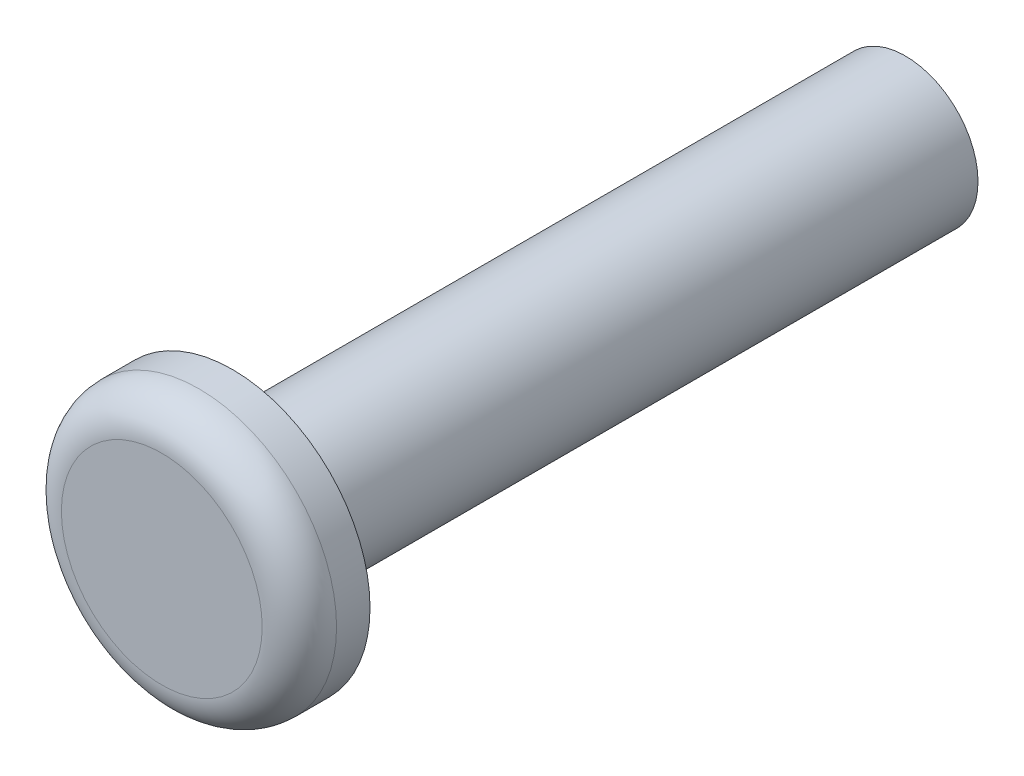
ISO-10303-21;
HEADER;
FILE_DESCRIPTION(('STEP AP214'),'2;1');
FILE_NAME('part.step','',(''),(''),'','','');
FILE_SCHEMA(('AUTOMOTIVE_DESIGN { 1 0 10303 214 1 1 1 1 }'));
ENDSEC;
DATA;
#1=APPLICATION_CONTEXT('core data for automotive mechanical design processes');
#2=APPLICATION_PROTOCOL_DEFINITION('international standard','automotive_design',2000,#1);
#3=PRODUCT_CONTEXT('',#1,'mechanical');
#4=PRODUCT('Part','Part','',(#3));
#5=PRODUCT_RELATED_PRODUCT_CATEGORY('part','',(#4));
#6=PRODUCT_DEFINITION_FORMATION('','',#4);
#7=PRODUCT_DEFINITION_CONTEXT('part definition',#1,'design');
#8=PRODUCT_DEFINITION('design','',#6,#7);
#9=PRODUCT_DEFINITION_SHAPE('','',#8);
#10=(LENGTH_UNIT() NAMED_UNIT(*) SI_UNIT(.MILLI.,.METRE.));
#11=(NAMED_UNIT(*) PLANE_ANGLE_UNIT() SI_UNIT($,.RADIAN.));
#12=(NAMED_UNIT(*) SI_UNIT($,.STERADIAN.) SOLID_ANGLE_UNIT());
#13=UNCERTAINTY_MEASURE_WITH_UNIT(LENGTH_MEASURE(1.E-05),#10,'distance_accuracy_value','');
#14=(GEOMETRIC_REPRESENTATION_CONTEXT(3) GLOBAL_UNCERTAINTY_ASSIGNED_CONTEXT((#13)) GLOBAL_UNIT_ASSIGNED_CONTEXT((#10,
#11,#12)) REPRESENTATION_CONTEXT('',''));
#15=CARTESIAN_POINT('',(0.,0.,0.));
#16=DIRECTION('',(0.,0.,1.));
#17=DIRECTION('',(1.,0.,0.));
#18=AXIS2_PLACEMENT_3D('',#15,#16,#17);
#19=CARTESIAN_POINT('',(0.,3.7,0.));
#20=DIRECTION('',(0.,0.,-1.));
#21=DIRECTION('',(-1.,0.,0.));
#22=AXIS2_PLACEMENT_3D('',#19,#20,#21);
#23=PLANE('',#22);
#24=CARTESIAN_POINT('',(0.,0.,0.));
#25=DIRECTION('',(0.,0.,-1.));
#26=DIRECTION('',(-1.,0.,0.));
#27=AXIS2_PLACEMENT_3D('',#24,#25,#26);
#28=CIRCLE('',#27,2.7);
#29=CARTESIAN_POINT('',(-2.7,0.,0.));
#30=VERTEX_POINT('',#29);
#31=EDGE_CURVE('E37',#30,#30,#28,.F.);
#32=ORIENTED_EDGE('',*,*,#31,.T.);
#33=EDGE_LOOP('',(#32));
#34=FACE_BOUND('',#33,.T.);
#35=ADVANCED_FACE('F30',(#34),#23,.F.);
#36=CARTESIAN_POINT('',(0.,0.,-20.));
#37=DIRECTION('',(0.,0.,1.));
#38=DIRECTION('',(1.,0.,0.));
#39=AXIS2_PLACEMENT_3D('',#36,#37,#38);
#40=PLANE('',#39);
#41=CARTESIAN_POINT('',(0.,0.,-20.));
#42=DIRECTION('',(0.,0.,1.));
#43=DIRECTION('',(1.,0.,0.));
#44=AXIS2_PLACEMENT_3D('',#41,#42,#43);
#45=CIRCLE('',#44,1.95);
#46=CARTESIAN_POINT('',(1.95,0.,-20.));
#47=VERTEX_POINT('',#46);
#48=EDGE_CURVE('E41',#47,#47,#45,.T.);
#49=ORIENTED_EDGE('',*,*,#48,.F.);
#50=EDGE_LOOP('',(#49));
#51=FACE_BOUND('',#50,.T.);
#52=ADVANCED_FACE('F65',(#51),#40,.F.);
#53=CARTESIAN_POINT('',(0.,0.,0.));
#54=DIRECTION('',(0.,0.,1.));
#55=DIRECTION('',(1.,0.,0.));
#56=AXIS2_PLACEMENT_3D('',#53,#54,#55);
#57=CYLINDRICAL_SURFACE('',#56,1.95);
#58=CARTESIAN_POINT('',(0.,0.,-1.9));
#59=DIRECTION('',(0.,0.,1.));
#60=DIRECTION('',(1.,0.,0.));
#61=AXIS2_PLACEMENT_3D('',#58,#59,#60);
#62=CIRCLE('',#61,1.95);
#63=CARTESIAN_POINT('',(1.95,0.,-1.9));
#64=VERTEX_POINT('',#63);
#65=EDGE_CURVE('E45',#64,#64,#62,.T.);
#66=ORIENTED_EDGE('',*,*,#65,.F.);
#67=EDGE_LOOP('',(#66));
#68=FACE_BOUND('',#67,.T.);
#69=ORIENTED_EDGE('',*,*,#48,.T.);
#70=EDGE_LOOP('',(#69));
#71=FACE_BOUND('',#70,.T.);
#72=ADVANCED_FACE('F59',(#68,#71),#57,.T.);
#73=CARTESIAN_POINT('',(0.,1.95,-1.9));
#74=DIRECTION('',(0.,0.,1.));
#75=DIRECTION('',(1.,0.,0.));
#76=AXIS2_PLACEMENT_3D('',#73,#74,#75);
#77=PLANE('',#76);
#78=CARTESIAN_POINT('',(0.,0.,-1.9));
#79=DIRECTION('',(0.,0.,1.));
#80=DIRECTION('',(1.,0.,0.));
#81=AXIS2_PLACEMENT_3D('',#78,#79,#80);
#82=CIRCLE('',#81,3.7);
#83=CARTESIAN_POINT('',(3.7,0.,-1.9));
#84=VERTEX_POINT('',#83);
#85=EDGE_CURVE('E50',#84,#84,#82,.T.);
#86=ORIENTED_EDGE('',*,*,#85,.F.);
#87=EDGE_LOOP('',(#86));
#88=FACE_BOUND('',#87,.T.);
#89=ORIENTED_EDGE('',*,*,#65,.T.);
#90=EDGE_LOOP('',(#89));
#91=FACE_BOUND('',#90,.T.);
#92=ADVANCED_FACE('F56',(#88,#91),#77,.F.);
#93=CARTESIAN_POINT('',(0.,0.,0.));
#94=DIRECTION('',(0.,0.,1.));
#95=DIRECTION('',(1.,0.,0.));
#96=AXIS2_PLACEMENT_3D('',#93,#94,#95);
#97=CYLINDRICAL_SURFACE('',#96,3.7);
#98=CARTESIAN_POINT('',(0.,0.,-1.));
#99=DIRECTION('',(0.,0.,-1.));
#100=DIRECTION('',(-1.,0.,0.));
#101=AXIS2_PLACEMENT_3D('',#98,#99,#100);
#102=CIRCLE('',#101,3.7);
#103=CARTESIAN_POINT('',(-3.7,0.,-1.));
#104=VERTEX_POINT('',#103);
#105=EDGE_CURVE('E10',#104,#104,#102,.T.);
#106=ORIENTED_EDGE('',*,*,#105,.T.);
#107=EDGE_LOOP('',(#106));
#108=FACE_BOUND('',#107,.T.);
#109=ORIENTED_EDGE('',*,*,#85,.T.);
#110=EDGE_LOOP('',(#109));
#111=FACE_BOUND('',#110,.T.);
#112=ADVANCED_FACE('F54',(#108,#111),#97,.T.);
#113=CARTESIAN_POINT('',(0.,0.,-1.));
#114=DIRECTION('',(0.,0.,-1.));
#115=DIRECTION('',(-1.,0.,0.));
#116=AXIS2_PLACEMENT_3D('',#113,#114,#115);
#117=TOROIDAL_SURFACE('',#116,2.7,1.);
#118=ORIENTED_EDGE('',*,*,#105,.F.);
#119=EDGE_LOOP('',(#118));
#120=FACE_BOUND('',#119,.T.);
#121=ORIENTED_EDGE('',*,*,#31,.F.);
#122=EDGE_LOOP('',(#121));
#123=FACE_BOUND('',#122,.T.);
#124=ADVANCED_FACE('F32',(#120,#123),#117,.T.);
#125=CLOSED_SHELL('',(#35,#52,#72,#92,#112,#124));
#126=MANIFOLD_SOLID_BREP('B2',#125);
#127=ADVANCED_BREP_SHAPE_REPRESENTATION('',(#18,#126),#14);
#128=SHAPE_DEFINITION_REPRESENTATION(#9,#127);
ENDSEC;
END-ISO-10303-21;
